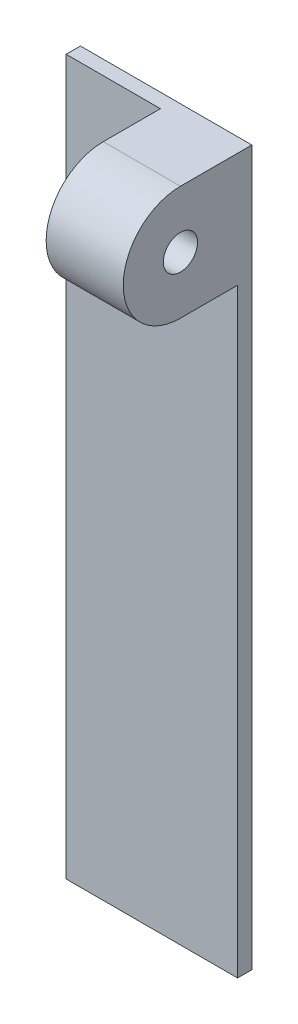
ISO-10303-21;
HEADER;
FILE_DESCRIPTION(('STEP AP214'),'2;1');
FILE_NAME('part.step','',(''),(''),'','','');
FILE_SCHEMA(('AUTOMOTIVE_DESIGN { 1 0 10303 214 1 1 1 1 }'));
ENDSEC;
DATA;
#1=APPLICATION_CONTEXT('core data for automotive mechanical design processes');
#2=APPLICATION_PROTOCOL_DEFINITION('international standard','automotive_design',2000,#1);
#3=PRODUCT_CONTEXT('',#1,'mechanical');
#4=PRODUCT('Part','Part','',(#3));
#5=PRODUCT_RELATED_PRODUCT_CATEGORY('part','',(#4));
#6=PRODUCT_DEFINITION_FORMATION('','',#4);
#7=PRODUCT_DEFINITION_CONTEXT('part definition',#1,'design');
#8=PRODUCT_DEFINITION('design','',#6,#7);
#9=PRODUCT_DEFINITION_SHAPE('','',#8);
#10=(LENGTH_UNIT() NAMED_UNIT(*) SI_UNIT(.MILLI.,.METRE.));
#11=(NAMED_UNIT(*) PLANE_ANGLE_UNIT() SI_UNIT($,.RADIAN.));
#12=(NAMED_UNIT(*) SI_UNIT($,.STERADIAN.) SOLID_ANGLE_UNIT());
#13=UNCERTAINTY_MEASURE_WITH_UNIT(LENGTH_MEASURE(1.E-05),#10,'distance_accuracy_value','');
#14=(GEOMETRIC_REPRESENTATION_CONTEXT(3) GLOBAL_UNCERTAINTY_ASSIGNED_CONTEXT((#13)) GLOBAL_UNIT_ASSIGNED_CONTEXT((#10,
#11,#12)) REPRESENTATION_CONTEXT('',''));
#15=CARTESIAN_POINT('',(0.,0.,0.));
#16=DIRECTION('',(0.,0.,1.));
#17=DIRECTION('',(1.,0.,0.));
#18=AXIS2_PLACEMENT_3D('',#15,#16,#17);
#19=CARTESIAN_POINT('',(-30.,-125.,5.));
#20=DIRECTION('',(1.,0.,0.));
#21=DIRECTION('',(0.,0.,-1.));
#22=AXIS2_PLACEMENT_3D('',#19,#20,#21);
#23=PLANE('',#22);
#24=DIRECTION('',(0.,-1.,0.));
#25=VECTOR('',#24,1.);
#26=CARTESIAN_POINT('',(-30.,-125.,0.));
#27=LINE('',#26,#25);
#28=CARTESIAN_POINT('',(-30.,125.,0.));
#29=VERTEX_POINT('',#28);
#30=CARTESIAN_POINT('',(-30.,-125.,0.));
#31=VERTEX_POINT('',#30);
#32=EDGE_CURVE('E146',#29,#31,#27,.T.);
#33=ORIENTED_EDGE('',*,*,#32,.T.);
#34=DIRECTION('',(0.,0.,-1.));
#35=VECTOR('',#34,1.);
#36=CARTESIAN_POINT('',(-30.,-125.,5.));
#37=LINE('',#36,#35);
#38=CARTESIAN_POINT('',(-30.,-125.,5.));
#39=VERTEX_POINT('',#38);
#40=EDGE_CURVE('E11',#39,#31,#37,.T.);
#41=ORIENTED_EDGE('',*,*,#40,.F.);
#42=DIRECTION('',(0.,-1.,0.));
#43=VECTOR('',#42,1.);
#44=CARTESIAN_POINT('',(-30.,-125.,5.));
#45=LINE('',#44,#43);
#46=CARTESIAN_POINT('',(-30.,125.,5.));
#47=VERTEX_POINT('',#46);
#48=EDGE_CURVE('E149',#47,#39,#45,.T.);
#49=ORIENTED_EDGE('',*,*,#48,.F.);
#50=DIRECTION('',(0.,0.,-1.));
#51=VECTOR('',#50,1.);
#52=CARTESIAN_POINT('',(-30.,125.,5.));
#53=LINE('',#52,#51);
#54=EDGE_CURVE('E160',#47,#29,#53,.T.);
#55=ORIENTED_EDGE('',*,*,#54,.T.);
#56=EDGE_LOOP('',(#33,#41,#49,#55));
#57=FACE_BOUND('',#56,.T.);
#58=ADVANCED_FACE('F41',(#57),#23,.F.);
#59=CARTESIAN_POINT('',(30.,-125.,5.));
#60=DIRECTION('',(0.,1.,0.));
#61=DIRECTION('',(-1.,0.,0.));
#62=AXIS2_PLACEMENT_3D('',#59,#60,#61);
#63=PLANE('',#62);
#64=DIRECTION('',(1.,0.,0.));
#65=VECTOR('',#64,1.);
#66=CARTESIAN_POINT('',(30.,-125.,0.));
#67=LINE('',#66,#65);
#68=CARTESIAN_POINT('',(30.,-125.,0.));
#69=VERTEX_POINT('',#68);
#70=EDGE_CURVE('E164',#31,#69,#67,.T.);
#71=ORIENTED_EDGE('',*,*,#70,.T.);
#72=DIRECTION('',(0.,0.,-1.));
#73=VECTOR('',#72,1.);
#74=CARTESIAN_POINT('',(30.,-125.,5.));
#75=LINE('',#74,#73);
#76=CARTESIAN_POINT('',(30.,-125.,5.));
#77=VERTEX_POINT('',#76);
#78=EDGE_CURVE('E50',#77,#69,#75,.T.);
#79=ORIENTED_EDGE('',*,*,#78,.F.);
#80=DIRECTION('',(1.,0.,0.));
#81=VECTOR('',#80,1.);
#82=CARTESIAN_POINT('',(30.,-125.,5.));
#83=LINE('',#82,#81);
#84=EDGE_CURVE('E91',#39,#77,#83,.T.);
#85=ORIENTED_EDGE('',*,*,#84,.F.);
#86=ORIENTED_EDGE('',*,*,#40,.T.);
#87=EDGE_LOOP('',(#71,#79,#85,#86));
#88=FACE_BOUND('',#87,.T.);
#89=ADVANCED_FACE('F204',(#88),#63,.F.);
#90=CARTESIAN_POINT('',(30.,-125.,5.));
#91=DIRECTION('',(-1.,0.,0.));
#92=DIRECTION('',(0.,0.,1.));
#93=AXIS2_PLACEMENT_3D('',#90,#91,#92);
#94=PLANE('',#93);
#95=CARTESIAN_POINT('',(30.,105.,24.9999999999999));
#96=DIRECTION('',(1.,0.,0.));
#97=DIRECTION('',(0.,0.,-1.));
#98=AXIS2_PLACEMENT_3D('',#95,#96,#97);
#99=CIRCLE('',#98,6.);
#100=CARTESIAN_POINT('',(30.,105.,18.9999999999999));
#101=VERTEX_POINT('',#100);
#102=EDGE_CURVE('E135',#101,#101,#99,.T.);
#103=ORIENTED_EDGE('',*,*,#102,.F.);
#104=EDGE_LOOP('',(#103));
#105=FACE_BOUND('',#104,.T.);
#106=DIRECTION('',(0.,1.,0.));
#107=VECTOR('',#106,1.);
#108=CARTESIAN_POINT('',(30.,-125.,0.));
#109=LINE('',#108,#107);
#110=CARTESIAN_POINT('',(30.,125.,0.));
#111=VERTEX_POINT('',#110);
#112=EDGE_CURVE('E167',#69,#111,#109,.T.);
#113=ORIENTED_EDGE('',*,*,#112,.T.);
#114=DIRECTION('',(0.,0.,-1.));
#115=VECTOR('',#114,1.);
#116=CARTESIAN_POINT('',(30.,125.,5.));
#117=LINE('',#116,#115);
#118=CARTESIAN_POINT('',(30.,125.,25.));
#119=VERTEX_POINT('',#118);
#120=EDGE_CURVE('E174',#119,#111,#117,.T.);
#121=ORIENTED_EDGE('',*,*,#120,.F.);
#122=CARTESIAN_POINT('',(30.,105.,25.));
#123=DIRECTION('',(1.,0.,0.));
#124=DIRECTION('',(0.,0.,-1.));
#125=AXIS2_PLACEMENT_3D('',#122,#123,#124);
#126=CIRCLE('',#125,20.);
#127=CARTESIAN_POINT('',(30.,85.,25.));
#128=VERTEX_POINT('',#127);
#129=EDGE_CURVE('E117',#119,#128,#126,.T.);
#130=ORIENTED_EDGE('',*,*,#129,.T.);
#131=DIRECTION('',(0.,0.,-1.));
#132=VECTOR('',#131,1.);
#133=CARTESIAN_POINT('',(30.,85.,4.99999999999999));
#134=LINE('',#133,#132);
#135=CARTESIAN_POINT('',(30.,85.,4.99999999999999));
#136=VERTEX_POINT('',#135);
#137=EDGE_CURVE('E129',#128,#136,#134,.T.);
#138=ORIENTED_EDGE('',*,*,#137,.T.);
#139=DIRECTION('',(0.,1.,0.));
#140=VECTOR('',#139,1.);
#141=CARTESIAN_POINT('',(30.,-125.,5.));
#142=LINE('',#141,#140);
#143=EDGE_CURVE('E154',#77,#136,#142,.T.);
#144=ORIENTED_EDGE('',*,*,#143,.F.);
#145=ORIENTED_EDGE('',*,*,#78,.T.);
#146=EDGE_LOOP('',(#113,#121,#130,#138,#144,#145));
#147=FACE_BOUND('',#146,.T.);
#148=ADVANCED_FACE('F182',(#105,#147),#94,.F.);
#149=CARTESIAN_POINT('',(30.,125.,5.));
#150=DIRECTION('',(0.,-1.,0.));
#151=DIRECTION('',(0.,0.,-1.));
#152=AXIS2_PLACEMENT_3D('',#149,#150,#151);
#153=PLANE('',#152);
#154=DIRECTION('',(-1.,0.,0.));
#155=VECTOR('',#154,1.);
#156=CARTESIAN_POINT('',(30.,125.,0.));
#157=LINE('',#156,#155);
#158=EDGE_CURVE('E86',#111,#29,#157,.T.);
#159=ORIENTED_EDGE('',*,*,#158,.T.);
#160=ORIENTED_EDGE('',*,*,#54,.F.);
#161=DIRECTION('',(-1.,0.,0.));
#162=VECTOR('',#161,1.);
#163=CARTESIAN_POINT('',(30.,125.,5.));
#164=LINE('',#163,#162);
#165=CARTESIAN_POINT('',(2.99999999999999,125.,5.));
#166=VERTEX_POINT('',#165);
#167=EDGE_CURVE('E65',#166,#47,#164,.T.);
#168=ORIENTED_EDGE('',*,*,#167,.F.);
#169=DIRECTION('',(0.,0.,1.));
#170=VECTOR('',#169,1.);
#171=CARTESIAN_POINT('',(2.99999999999999,125.,5.));
#172=LINE('',#171,#170);
#173=CARTESIAN_POINT('',(2.99999999999999,125.,25.));
#174=VERTEX_POINT('',#173);
#175=EDGE_CURVE('E57',#166,#174,#172,.T.);
#176=ORIENTED_EDGE('',*,*,#175,.T.);
#177=DIRECTION('',(1.,0.,0.));
#178=VECTOR('',#177,1.);
#179=CARTESIAN_POINT('',(2.99999999999999,125.,25.));
#180=LINE('',#179,#178);
#181=EDGE_CURVE('E113',#174,#119,#180,.T.);
#182=ORIENTED_EDGE('',*,*,#181,.T.);
#183=ORIENTED_EDGE('',*,*,#120,.T.);
#184=EDGE_LOOP('',(#159,#160,#168,#176,#182,#183));
#185=FACE_BOUND('',#184,.T.);
#186=ADVANCED_FACE('F127',(#185),#153,.F.);
#187=CARTESIAN_POINT('',(0.,0.,5.));
#188=DIRECTION('',(0.,0.,1.));
#189=DIRECTION('',(1.,0.,0.));
#190=AXIS2_PLACEMENT_3D('',#187,#188,#189);
#191=PLANE('',#190);
#192=DIRECTION('',(1.,0.,0.));
#193=VECTOR('',#192,1.);
#194=CARTESIAN_POINT('',(2.99999999999999,85.,4.99999999999999));
#195=LINE('',#194,#193);
#196=CARTESIAN_POINT('',(2.99999999999999,85.,4.99999999999999));
#197=VERTEX_POINT('',#196);
#198=EDGE_CURVE('E143',#197,#136,#195,.T.);
#199=ORIENTED_EDGE('',*,*,#198,.F.);
#200=DIRECTION('',(0.,1.,0.));
#201=VECTOR('',#200,1.);
#202=CARTESIAN_POINT('',(2.99999999999999,125.,5.));
#203=LINE('',#202,#201);
#204=EDGE_CURVE('E120',#197,#166,#203,.T.);
#205=ORIENTED_EDGE('',*,*,#204,.T.);
#206=ORIENTED_EDGE('',*,*,#167,.T.);
#207=ORIENTED_EDGE('',*,*,#48,.T.);
#208=ORIENTED_EDGE('',*,*,#84,.T.);
#209=ORIENTED_EDGE('',*,*,#143,.T.);
#210=EDGE_LOOP('',(#199,#205,#206,#207,#208,#209));
#211=FACE_BOUND('',#210,.T.);
#212=ADVANCED_FACE('F190',(#211),#191,.T.);
#213=CARTESIAN_POINT('',(0.,0.,0.));
#214=DIRECTION('',(0.,0.,1.));
#215=DIRECTION('',(1.,0.,0.));
#216=AXIS2_PLACEMENT_3D('',#213,#214,#215);
#217=PLANE('',#216);
#218=ORIENTED_EDGE('',*,*,#32,.F.);
#219=ORIENTED_EDGE('',*,*,#158,.F.);
#220=ORIENTED_EDGE('',*,*,#112,.F.);
#221=ORIENTED_EDGE('',*,*,#70,.F.);
#222=EDGE_LOOP('',(#218,#219,#220,#221));
#223=FACE_BOUND('',#222,.T.);
#224=ADVANCED_FACE('F185',(#223),#217,.F.);
#225=CARTESIAN_POINT('',(2.99999999999999,85.,4.99999999999999));
#226=DIRECTION('',(0.,-1.,0.));
#227=DIRECTION('',(0.,0.,-1.));
#228=AXIS2_PLACEMENT_3D('',#225,#226,#227);
#229=PLANE('',#228);
#230=ORIENTED_EDGE('',*,*,#137,.F.);
#231=DIRECTION('',(1.,0.,0.));
#232=VECTOR('',#231,1.);
#233=CARTESIAN_POINT('',(2.99999999999999,85.,25.));
#234=LINE('',#233,#232);
#235=CARTESIAN_POINT('',(2.99999999999999,85.,25.));
#236=VERTEX_POINT('',#235);
#237=EDGE_CURVE('E119',#236,#128,#234,.T.);
#238=ORIENTED_EDGE('',*,*,#237,.F.);
#239=DIRECTION('',(0.,0.,-1.));
#240=VECTOR('',#239,1.);
#241=CARTESIAN_POINT('',(2.99999999999999,85.,4.99999999999999));
#242=LINE('',#241,#240);
#243=EDGE_CURVE('E124',#236,#197,#242,.T.);
#244=ORIENTED_EDGE('',*,*,#243,.T.);
#245=ORIENTED_EDGE('',*,*,#198,.T.);
#246=EDGE_LOOP('',(#230,#238,#244,#245));
#247=FACE_BOUND('',#246,.T.);
#248=ADVANCED_FACE('F193',(#247),#229,.T.);
#249=CARTESIAN_POINT('',(2.99999999999999,105.,25.));
#250=DIRECTION('',(1.,0.,0.));
#251=DIRECTION('',(0.,0.,-1.));
#252=AXIS2_PLACEMENT_3D('',#249,#250,#251);
#253=CYLINDRICAL_SURFACE('',#252,20.);
#254=ORIENTED_EDGE('',*,*,#129,.F.);
#255=ORIENTED_EDGE('',*,*,#181,.F.);
#256=CARTESIAN_POINT('',(2.99999999999999,105.,25.));
#257=DIRECTION('',(1.,0.,0.));
#258=DIRECTION('',(0.,0.,-1.));
#259=AXIS2_PLACEMENT_3D('',#256,#257,#258);
#260=CIRCLE('',#259,20.);
#261=EDGE_CURVE('E115',#174,#236,#260,.T.);
#262=ORIENTED_EDGE('',*,*,#261,.T.);
#263=ORIENTED_EDGE('',*,*,#237,.T.);
#264=EDGE_LOOP('',(#254,#255,#262,#263));
#265=FACE_BOUND('',#264,.T.);
#266=ADVANCED_FACE('F114',(#265),#253,.T.);
#267=CARTESIAN_POINT('',(2.99999999999999,105.,25.));
#268=DIRECTION('',(1.,0.,0.));
#269=DIRECTION('',(0.,0.,-1.));
#270=AXIS2_PLACEMENT_3D('',#267,#268,#269);
#271=PLANE('',#270);
#272=CARTESIAN_POINT('',(2.99999999999999,105.,24.9999999999999));
#273=DIRECTION('',(1.,0.,0.));
#274=DIRECTION('',(0.,0.,-1.));
#275=AXIS2_PLACEMENT_3D('',#272,#273,#274);
#276=CIRCLE('',#275,6.);
#277=CARTESIAN_POINT('',(2.99999999999999,105.,18.9999999999999));
#278=VERTEX_POINT('',#277);
#279=EDGE_CURVE('E44',#278,#278,#276,.T.);
#280=ORIENTED_EDGE('',*,*,#279,.T.);
#281=EDGE_LOOP('',(#280));
#282=FACE_BOUND('',#281,.T.);
#283=ORIENTED_EDGE('',*,*,#175,.F.);
#284=ORIENTED_EDGE('',*,*,#204,.F.);
#285=ORIENTED_EDGE('',*,*,#243,.F.);
#286=ORIENTED_EDGE('',*,*,#261,.F.);
#287=EDGE_LOOP('',(#283,#284,#285,#286));
#288=FACE_BOUND('',#287,.T.);
#289=ADVANCED_FACE('F123',(#282,#288),#271,.F.);
#290=CARTESIAN_POINT('',(-30.,105.,24.9999999999999));
#291=DIRECTION('',(1.,0.,0.));
#292=DIRECTION('',(0.,0.,-1.));
#293=AXIS2_PLACEMENT_3D('',#290,#291,#292);
#294=CYLINDRICAL_SURFACE('',#293,6.);
#295=ORIENTED_EDGE('',*,*,#102,.T.);
#296=EDGE_LOOP('',(#295));
#297=FACE_BOUND('',#296,.T.);
#298=ORIENTED_EDGE('',*,*,#279,.F.);
#299=EDGE_LOOP('',(#298));
#300=FACE_BOUND('',#299,.T.);
#301=ADVANCED_FACE('F258',(#297,#300),#294,.F.);
#302=CLOSED_SHELL('',(#58,#89,#148,#186,#212,#224,#248,#266,#289,#301));
#303=MANIFOLD_SOLID_BREP('B2',#302);
#304=ADVANCED_BREP_SHAPE_REPRESENTATION('',(#18,#303),#14);
#305=SHAPE_DEFINITION_REPRESENTATION(#9,#304);
ENDSEC;
END-ISO-10303-21;
